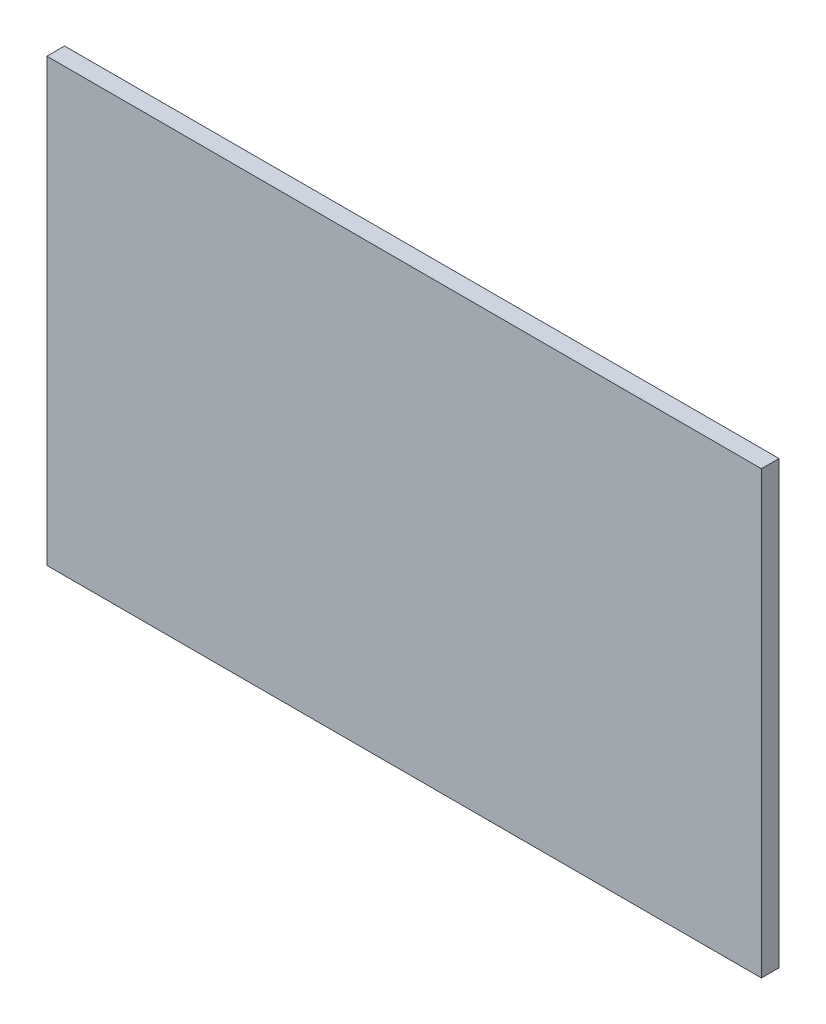
ISO-10303-21;
HEADER;
FILE_DESCRIPTION(('STEP AP214'),'2;1');
FILE_NAME('part.step','',(''),(''),'','','');
FILE_SCHEMA(('AUTOMOTIVE_DESIGN { 1 0 10303 214 1 1 1 1 }'));
ENDSEC;
DATA;
#1=APPLICATION_CONTEXT('core data for automotive mechanical design processes');
#2=APPLICATION_PROTOCOL_DEFINITION('international standard','automotive_design',2000,#1);
#3=PRODUCT_CONTEXT('',#1,'mechanical');
#4=PRODUCT('Part','Part','',(#3));
#5=PRODUCT_RELATED_PRODUCT_CATEGORY('part','',(#4));
#6=PRODUCT_DEFINITION_FORMATION('','',#4);
#7=PRODUCT_DEFINITION_CONTEXT('part definition',#1,'design');
#8=PRODUCT_DEFINITION('design','',#6,#7);
#9=PRODUCT_DEFINITION_SHAPE('','',#8);
#10=(LENGTH_UNIT() NAMED_UNIT(*) SI_UNIT(.MILLI.,.METRE.));
#11=(NAMED_UNIT(*) PLANE_ANGLE_UNIT() SI_UNIT($,.RADIAN.));
#12=(NAMED_UNIT(*) SI_UNIT($,.STERADIAN.) SOLID_ANGLE_UNIT());
#13=UNCERTAINTY_MEASURE_WITH_UNIT(LENGTH_MEASURE(1.E-05),#10,'distance_accuracy_value','');
#14=(GEOMETRIC_REPRESENTATION_CONTEXT(3) GLOBAL_UNCERTAINTY_ASSIGNED_CONTEXT((#13)) GLOBAL_UNIT_ASSIGNED_CONTEXT((#10,
#11,#12)) REPRESENTATION_CONTEXT('',''));
#15=CARTESIAN_POINT('',(0.,0.,0.));
#16=DIRECTION('',(0.,0.,1.));
#17=DIRECTION('',(1.,0.,0.));
#18=AXIS2_PLACEMENT_3D('',#15,#16,#17);
#19=CARTESIAN_POINT('',(-56.9485584676371,38.0705336426914,16.));
#20=DIRECTION('',(1.,0.,0.));
#21=DIRECTION('',(0.,1.,0.));
#22=AXIS2_PLACEMENT_3D('',#19,#20,#21);
#23=PLANE('',#22);
#24=DIRECTION('',(0.,-1.,0.));
#25=VECTOR('',#24,1.);
#26=CARTESIAN_POINT('',(-56.9485584676371,38.0705336426914,0.));
#27=LINE('',#26,#25);
#28=CARTESIAN_POINT('',(-56.9485584676371,38.0705336426914,0.));
#29=VERTEX_POINT('',#28);
#30=CARTESIAN_POINT('',(-56.948558467637,-361.929466357309,0.));
#31=VERTEX_POINT('',#30);
#32=EDGE_CURVE('E96',#29,#31,#27,.T.);
#33=ORIENTED_EDGE('',*,*,#32,.T.);
#34=DIRECTION('',(0.,0.,-1.));
#35=VECTOR('',#34,1.);
#36=CARTESIAN_POINT('',(-56.948558467637,-361.929466357309,16.));
#37=LINE('',#36,#35);
#38=CARTESIAN_POINT('',(-56.948558467637,-361.929466357309,16.));
#39=VERTEX_POINT('',#38);
#40=EDGE_CURVE('E11',#39,#31,#37,.T.);
#41=ORIENTED_EDGE('',*,*,#40,.F.);
#42=DIRECTION('',(0.,-1.,0.));
#43=VECTOR('',#42,1.);
#44=CARTESIAN_POINT('',(-56.9485584676371,38.0705336426914,16.));
#45=LINE('',#44,#43);
#46=CARTESIAN_POINT('',(-56.9485584676371,38.0705336426914,16.));
#47=VERTEX_POINT('',#46);
#48=EDGE_CURVE('E84',#47,#39,#45,.T.);
#49=ORIENTED_EDGE('',*,*,#48,.F.);
#50=DIRECTION('',(0.,0.,-1.));
#51=VECTOR('',#50,1.);
#52=CARTESIAN_POINT('',(-56.9485584676371,38.0705336426914,16.));
#53=LINE('',#52,#51);
#54=EDGE_CURVE('E92',#47,#29,#53,.T.);
#55=ORIENTED_EDGE('',*,*,#54,.T.);
#56=EDGE_LOOP('',(#33,#41,#49,#55));
#57=FACE_BOUND('',#56,.T.);
#58=ADVANCED_FACE('F33',(#57),#23,.F.);
#59=CARTESIAN_POINT('',(-56.948558467637,-361.929466357309,16.));
#60=DIRECTION('',(0.,1.,0.));
#61=DIRECTION('',(0.,0.,1.));
#62=AXIS2_PLACEMENT_3D('',#59,#60,#61);
#63=PLANE('',#62);
#64=DIRECTION('',(1.,0.,0.));
#65=VECTOR('',#64,1.);
#66=CARTESIAN_POINT('',(-56.948558467637,-361.929466357309,0.));
#67=LINE('',#66,#65);
#68=CARTESIAN_POINT('',(591.051441532363,-361.929466357309,0.));
#69=VERTEX_POINT('',#68);
#70=EDGE_CURVE('E88',#31,#69,#67,.T.);
#71=ORIENTED_EDGE('',*,*,#70,.T.);
#72=DIRECTION('',(0.,0.,-1.));
#73=VECTOR('',#72,1.);
#74=CARTESIAN_POINT('',(591.051441532363,-361.929466357309,16.));
#75=LINE('',#74,#73);
#76=CARTESIAN_POINT('',(591.051441532363,-361.929466357309,16.));
#77=VERTEX_POINT('',#76);
#78=EDGE_CURVE('E41',#77,#69,#75,.T.);
#79=ORIENTED_EDGE('',*,*,#78,.F.);
#80=DIRECTION('',(1.,0.,0.));
#81=VECTOR('',#80,1.);
#82=CARTESIAN_POINT('',(-56.948558467637,-361.929466357309,16.));
#83=LINE('',#82,#81);
#84=EDGE_CURVE('E79',#39,#77,#83,.T.);
#85=ORIENTED_EDGE('',*,*,#84,.F.);
#86=ORIENTED_EDGE('',*,*,#40,.T.);
#87=EDGE_LOOP('',(#71,#79,#85,#86));
#88=FACE_BOUND('',#87,.T.);
#89=ADVANCED_FACE('F87',(#88),#63,.F.);
#90=CARTESIAN_POINT('',(591.051441532363,38.0705336426914,16.));
#91=DIRECTION('',(-1.,0.,0.));
#92=DIRECTION('',(0.,0.,1.));
#93=AXIS2_PLACEMENT_3D('',#90,#91,#92);
#94=PLANE('',#93);
#95=DIRECTION('',(0.,1.,0.));
#96=VECTOR('',#95,1.);
#97=CARTESIAN_POINT('',(591.051441532363,38.0705336426914,0.));
#98=LINE('',#97,#96);
#99=CARTESIAN_POINT('',(591.051441532363,38.0705336426914,0.));
#100=VERTEX_POINT('',#99);
#101=EDGE_CURVE('E66',#69,#100,#98,.T.);
#102=ORIENTED_EDGE('',*,*,#101,.T.);
#103=DIRECTION('',(0.,0.,-1.));
#104=VECTOR('',#103,1.);
#105=CARTESIAN_POINT('',(591.051441532363,38.0705336426914,16.));
#106=LINE('',#105,#104);
#107=CARTESIAN_POINT('',(591.051441532363,38.0705336426914,16.));
#108=VERTEX_POINT('',#107);
#109=EDGE_CURVE('E89',#108,#100,#106,.T.);
#110=ORIENTED_EDGE('',*,*,#109,.F.);
#111=DIRECTION('',(0.,1.,0.));
#112=VECTOR('',#111,1.);
#113=CARTESIAN_POINT('',(591.051441532363,38.0705336426914,16.));
#114=LINE('',#113,#112);
#115=EDGE_CURVE('E82',#77,#108,#114,.T.);
#116=ORIENTED_EDGE('',*,*,#115,.F.);
#117=ORIENTED_EDGE('',*,*,#78,.T.);
#118=EDGE_LOOP('',(#102,#110,#116,#117));
#119=FACE_BOUND('',#118,.T.);
#120=ADVANCED_FACE('F90',(#119),#94,.F.);
#121=CARTESIAN_POINT('',(-56.9485584676371,38.0705336426914,16.));
#122=DIRECTION('',(0.,-1.,0.));
#123=DIRECTION('',(0.,0.,-1.));
#124=AXIS2_PLACEMENT_3D('',#121,#122,#123);
#125=PLANE('',#124);
#126=DIRECTION('',(-1.,0.,0.));
#127=VECTOR('',#126,1.);
#128=CARTESIAN_POINT('',(-56.9485584676371,38.0705336426914,0.));
#129=LINE('',#128,#127);
#130=EDGE_CURVE('E72',#100,#29,#129,.T.);
#131=ORIENTED_EDGE('',*,*,#130,.T.);
#132=ORIENTED_EDGE('',*,*,#54,.F.);
#133=DIRECTION('',(-1.,0.,0.));
#134=VECTOR('',#133,1.);
#135=CARTESIAN_POINT('',(-56.9485584676371,38.0705336426914,16.));
#136=LINE('',#135,#134);
#137=EDGE_CURVE('E49',#108,#47,#136,.T.);
#138=ORIENTED_EDGE('',*,*,#137,.F.);
#139=ORIENTED_EDGE('',*,*,#109,.T.);
#140=EDGE_LOOP('',(#131,#132,#138,#139));
#141=FACE_BOUND('',#140,.T.);
#142=ADVANCED_FACE('F103',(#141),#125,.F.);
#143=CARTESIAN_POINT('',(0.,0.,16.));
#144=DIRECTION('',(0.,0.,1.));
#145=DIRECTION('',(1.,0.,0.));
#146=AXIS2_PLACEMENT_3D('',#143,#144,#145);
#147=PLANE('',#146);
#148=ORIENTED_EDGE('',*,*,#48,.T.);
#149=ORIENTED_EDGE('',*,*,#84,.T.);
#150=ORIENTED_EDGE('',*,*,#115,.T.);
#151=ORIENTED_EDGE('',*,*,#137,.T.);
#152=EDGE_LOOP('',(#148,#149,#150,#151));
#153=FACE_BOUND('',#152,.T.);
#154=ADVANCED_FACE('F80',(#153),#147,.T.);
#155=CARTESIAN_POINT('',(0.,0.,0.));
#156=DIRECTION('',(0.,0.,1.));
#157=DIRECTION('',(1.,0.,0.));
#158=AXIS2_PLACEMENT_3D('',#155,#156,#157);
#159=PLANE('',#158);
#160=ORIENTED_EDGE('',*,*,#32,.F.);
#161=ORIENTED_EDGE('',*,*,#130,.F.);
#162=ORIENTED_EDGE('',*,*,#101,.F.);
#163=ORIENTED_EDGE('',*,*,#70,.F.);
#164=EDGE_LOOP('',(#160,#161,#162,#163));
#165=FACE_BOUND('',#164,.T.);
#166=ADVANCED_FACE('F106',(#165),#159,.F.);
#167=CLOSED_SHELL('',(#58,#89,#120,#142,#154,#166));
#168=MANIFOLD_SOLID_BREP('B2',#167);
#169=ADVANCED_BREP_SHAPE_REPRESENTATION('',(#18,#168),#14);
#170=SHAPE_DEFINITION_REPRESENTATION(#9,#169);
ENDSEC;
END-ISO-10303-21;
